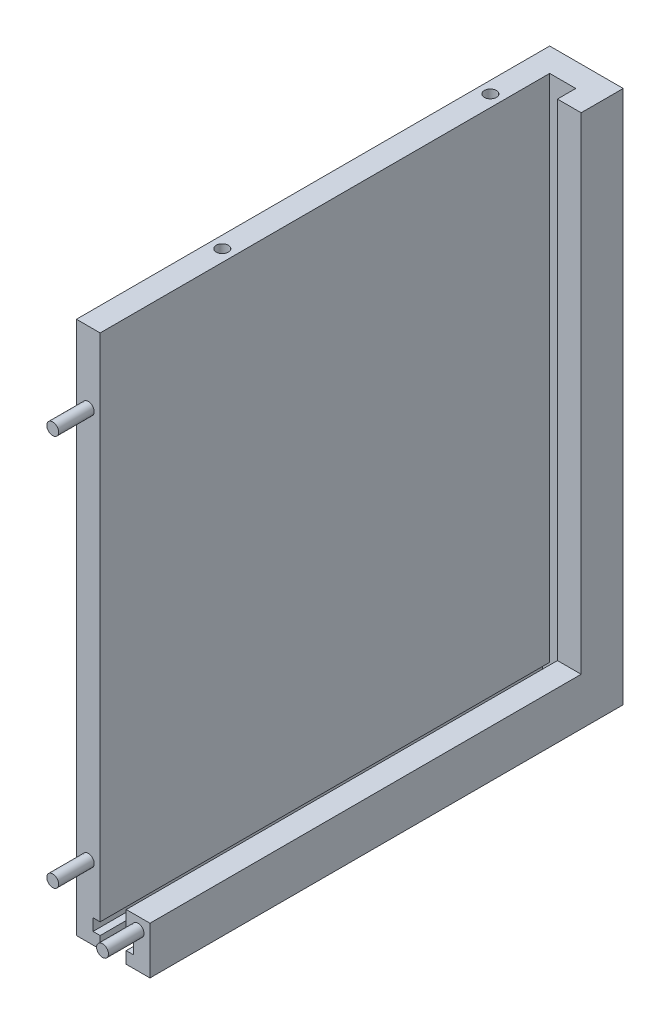
ISO-10303-21;
HEADER;
FILE_DESCRIPTION(('STEP AP214'),'2;1');
FILE_NAME('part.step','',(''),(''),'','','');
FILE_SCHEMA(('AUTOMOTIVE_DESIGN { 1 0 10303 214 1 1 1 1 }'));
ENDSEC;
DATA;
#1=APPLICATION_CONTEXT('core data for automotive mechanical design processes');
#2=APPLICATION_PROTOCOL_DEFINITION('international standard','automotive_design',2000,#1);
#3=PRODUCT_CONTEXT('',#1,'mechanical');
#4=PRODUCT('Part','Part','',(#3));
#5=PRODUCT_RELATED_PRODUCT_CATEGORY('part','',(#4));
#6=PRODUCT_DEFINITION_FORMATION('','',#4);
#7=PRODUCT_DEFINITION_CONTEXT('part definition',#1,'design');
#8=PRODUCT_DEFINITION('design','',#6,#7);
#9=PRODUCT_DEFINITION_SHAPE('','',#8);
#10=(LENGTH_UNIT() NAMED_UNIT(*) SI_UNIT(.MILLI.,.METRE.));
#11=(NAMED_UNIT(*) PLANE_ANGLE_UNIT() SI_UNIT($,.RADIAN.));
#12=(NAMED_UNIT(*) SI_UNIT($,.STERADIAN.) SOLID_ANGLE_UNIT());
#13=UNCERTAINTY_MEASURE_WITH_UNIT(LENGTH_MEASURE(1.E-05),#10,'distance_accuracy_value','');
#14=(GEOMETRIC_REPRESENTATION_CONTEXT(3) GLOBAL_UNCERTAINTY_ASSIGNED_CONTEXT((#13)) GLOBAL_UNIT_ASSIGNED_CONTEXT((#10,
#11,#12)) REPRESENTATION_CONTEXT('',''));
#15=CARTESIAN_POINT('',(0.,0.,0.));
#16=DIRECTION('',(0.,0.,1.));
#17=DIRECTION('',(1.,0.,0.));
#18=AXIS2_PLACEMENT_3D('',#15,#16,#17);
#19=CARTESIAN_POINT('',(0.,0.,-199.51));
#20=DIRECTION('',(0.,-1.,0.));
#21=DIRECTION('',(0.,0.,-1.));
#22=AXIS2_PLACEMENT_3D('',#19,#20,#21);
#23=PLANE('',#22);
#24=CARTESIAN_POINT('',(4.99999999999995,0.,-169.5));
#25=DIRECTION('',(0.,1.,0.));
#26=DIRECTION('',(0.,0.,1.));
#27=AXIS2_PLACEMENT_3D('',#24,#25,#26);
#28=CIRCLE('',#27,2.55);
#29=CARTESIAN_POINT('',(4.99999999999995,0.,-166.95));
#30=VERTEX_POINT('',#29);
#31=EDGE_CURVE('E292',#30,#30,#28,.T.);
#32=ORIENTED_EDGE('',*,*,#31,.F.);
#33=EDGE_LOOP('',(#32));
#34=FACE_BOUND('',#33,.T.);
#35=CARTESIAN_POINT('',(4.99999999999997,0.,-56.5));
#36=DIRECTION('',(0.,1.,0.));
#37=DIRECTION('',(0.,0.,1.));
#38=AXIS2_PLACEMENT_3D('',#35,#36,#37);
#39=CIRCLE('',#38,2.55);
#40=CARTESIAN_POINT('',(4.99999999999997,0.,-53.95));
#41=VERTEX_POINT('',#40);
#42=EDGE_CURVE('E299',#41,#41,#39,.T.);
#43=ORIENTED_EDGE('',*,*,#42,.F.);
#44=EDGE_LOOP('',(#43));
#45=FACE_BOUND('',#44,.T.);
#46=DIRECTION('',(-1.,0.,0.));
#47=VECTOR('',#46,1.);
#48=CARTESIAN_POINT('',(0.,0.,0.));
#49=LINE('',#48,#47);
#50=CARTESIAN_POINT('',(10.,0.,0.));
#51=VERTEX_POINT('',#50);
#52=CARTESIAN_POINT('',(0.,0.,0.));
#53=VERTEX_POINT('',#52);
#54=EDGE_CURVE('E180',#51,#53,#49,.T.);
#55=ORIENTED_EDGE('',*,*,#54,.F.);
#56=DIRECTION('',(0.,0.,1.));
#57=VECTOR('',#56,1.);
#58=CARTESIAN_POINT('',(10.,0.,0.));
#59=LINE('',#58,#57);
#60=CARTESIAN_POINT('',(10.,0.,-189.5));
#61=VERTEX_POINT('',#60);
#62=EDGE_CURVE('E212',#61,#51,#59,.T.);
#63=ORIENTED_EDGE('',*,*,#62,.F.);
#64=DIRECTION('',(1.,0.,0.));
#65=VECTOR('',#64,1.);
#66=CARTESIAN_POINT('',(21.,0.,-189.5));
#67=LINE('',#66,#65);
#68=CARTESIAN_POINT('',(21.,0.,-189.5));
#69=VERTEX_POINT('',#68);
#70=EDGE_CURVE('E46',#61,#69,#67,.T.);
#71=ORIENTED_EDGE('',*,*,#70,.T.);
#72=DIRECTION('',(0.,0.,1.));
#73=VECTOR('',#72,1.);
#74=CARTESIAN_POINT('',(21.,0.,0.));
#75=LINE('',#74,#73);
#76=CARTESIAN_POINT('',(21.,0.,-181.766666666667));
#77=VERTEX_POINT('',#76);
#78=EDGE_CURVE('E222',#69,#77,#75,.T.);
#79=ORIENTED_EDGE('',*,*,#78,.T.);
#80=DIRECTION('',(1.,0.,0.));
#81=VECTOR('',#80,1.);
#82=CARTESIAN_POINT('',(31.,0.,-181.766666666667));
#83=LINE('',#82,#81);
#84=CARTESIAN_POINT('',(31.,0.,-181.766666666667));
#85=VERTEX_POINT('',#84);
#86=EDGE_CURVE('E215',#77,#85,#83,.T.);
#87=ORIENTED_EDGE('',*,*,#86,.T.);
#88=DIRECTION('',(0.,0.,1.));
#89=VECTOR('',#88,1.);
#90=CARTESIAN_POINT('',(31.,0.,0.));
#91=LINE('',#90,#89);
#92=CARTESIAN_POINT('',(31.,0.,-199.5));
#93=VERTEX_POINT('',#92);
#94=EDGE_CURVE('E216',#93,#85,#91,.T.);
#95=ORIENTED_EDGE('',*,*,#94,.F.);
#96=DIRECTION('',(1.,0.,0.));
#97=VECTOR('',#96,1.);
#98=CARTESIAN_POINT('',(10.,0.,-199.5));
#99=LINE('',#98,#97);
#100=CARTESIAN_POINT('',(0.,0.,-199.5));
#101=VERTEX_POINT('',#100);
#102=EDGE_CURVE('E218',#101,#93,#99,.T.);
#103=ORIENTED_EDGE('',*,*,#102,.F.);
#104=DIRECTION('',(0.,0.,1.));
#105=VECTOR('',#104,1.);
#106=CARTESIAN_POINT('',(0.,0.,0.));
#107=LINE('',#106,#105);
#108=EDGE_CURVE('E219',#101,#53,#107,.T.);
#109=ORIENTED_EDGE('',*,*,#108,.T.);
#110=EDGE_LOOP('',(#55,#63,#71,#79,#87,#95,#103,#109));
#111=FACE_BOUND('',#110,.T.);
#112=ADVANCED_FACE('F39',(#34,#45,#111),#23,.F.);
#113=CARTESIAN_POINT('',(10.,-225.,-199.5));
#114=DIRECTION('',(0.,1.,0.));
#115=DIRECTION('',(0.,0.,1.));
#116=AXIS2_PLACEMENT_3D('',#113,#114,#115);
#117=PLANE('',#116);
#118=DIRECTION('',(1.,0.,0.));
#119=VECTOR('',#118,1.);
#120=CARTESIAN_POINT('',(0.,-225.,0.));
#121=LINE('',#120,#119);
#122=CARTESIAN_POINT('',(0.,-225.,0.));
#123=VERTEX_POINT('',#122);
#124=CARTESIAN_POINT('',(10.,-225.,0.));
#125=VERTEX_POINT('',#124);
#126=EDGE_CURVE('E169',#123,#125,#121,.T.);
#127=ORIENTED_EDGE('',*,*,#126,.F.);
#128=DIRECTION('',(0.,0.,-1.));
#129=VECTOR('',#128,1.);
#130=CARTESIAN_POINT('',(0.,-225.,-199.5));
#131=LINE('',#130,#129);
#132=CARTESIAN_POINT('',(0.,-225.,-199.5));
#133=VERTEX_POINT('',#132);
#134=EDGE_CURVE('E203',#123,#133,#131,.T.);
#135=ORIENTED_EDGE('',*,*,#134,.T.);
#136=DIRECTION('',(-1.,0.,0.));
#137=VECTOR('',#136,1.);
#138=CARTESIAN_POINT('',(10.,-225.,-199.5));
#139=LINE('',#138,#137);
#140=CARTESIAN_POINT('',(31.,-225.,-199.5));
#141=VERTEX_POINT('',#140);
#142=EDGE_CURVE('E185',#141,#133,#139,.T.);
#143=ORIENTED_EDGE('',*,*,#142,.F.);
#144=DIRECTION('',(0.,0.,-1.));
#145=VECTOR('',#144,1.);
#146=CARTESIAN_POINT('',(31.,-225.,-199.5));
#147=LINE('',#146,#145);
#148=CARTESIAN_POINT('',(31.,-225.,0.));
#149=VERTEX_POINT('',#148);
#150=EDGE_CURVE('E176',#149,#141,#147,.T.);
#151=ORIENTED_EDGE('',*,*,#150,.F.);
#152=CARTESIAN_POINT('',(21.,-225.,0.));
#153=VERTEX_POINT('',#152);
#154=EDGE_CURVE('E160',#153,#149,#121,.T.);
#155=ORIENTED_EDGE('',*,*,#154,.F.);
#156=DIRECTION('',(0.,0.,1.));
#157=VECTOR('',#156,1.);
#158=CARTESIAN_POINT('',(21.,-225.,-189.5));
#159=LINE('',#158,#157);
#160=CARTESIAN_POINT('',(21.,-225.,-189.5));
#161=VERTEX_POINT('',#160);
#162=EDGE_CURVE('E321',#161,#153,#159,.T.);
#163=ORIENTED_EDGE('',*,*,#162,.F.);
#164=DIRECTION('',(1.,0.,0.));
#165=VECTOR('',#164,1.);
#166=CARTESIAN_POINT('',(0.,-225.,-189.5));
#167=LINE('',#166,#165);
#168=CARTESIAN_POINT('',(10.,-225.,-189.5));
#169=VERTEX_POINT('',#168);
#170=EDGE_CURVE('E295',#169,#161,#167,.T.);
#171=ORIENTED_EDGE('',*,*,#170,.F.);
#172=DIRECTION('',(0.,0.,1.));
#173=VECTOR('',#172,1.);
#174=CARTESIAN_POINT('',(10.,-225.,-189.5));
#175=LINE('',#174,#173);
#176=EDGE_CURVE('E244',#169,#125,#175,.T.);
#177=ORIENTED_EDGE('',*,*,#176,.T.);
#178=EDGE_LOOP('',(#127,#135,#143,#151,#155,#163,#171,#177));
#179=FACE_BOUND('',#178,.T.);
#180=ADVANCED_FACE('F183',(#179),#117,.F.);
#181=CARTESIAN_POINT('',(0.,0.,0.));
#182=DIRECTION('',(-1.,0.,0.));
#183=DIRECTION('',(0.,0.,1.));
#184=AXIS2_PLACEMENT_3D('',#181,#182,#183);
#185=PLANE('',#184);
#186=ORIENTED_EDGE('',*,*,#134,.F.);
#187=DIRECTION('',(0.,-1.,0.));
#188=VECTOR('',#187,1.);
#189=CARTESIAN_POINT('',(0.,-225.,0.));
#190=LINE('',#189,#188);
#191=EDGE_CURVE('E438',#53,#123,#190,.T.);
#192=ORIENTED_EDGE('',*,*,#191,.F.);
#193=ORIENTED_EDGE('',*,*,#108,.F.);
#194=DIRECTION('',(0.,1.,0.));
#195=VECTOR('',#194,1.);
#196=CARTESIAN_POINT('',(0.,-225.,-199.5));
#197=LINE('',#196,#195);
#198=EDGE_CURVE('E208',#133,#101,#197,.T.);
#199=ORIENTED_EDGE('',*,*,#198,.F.);
#200=EDGE_LOOP('',(#186,#192,#193,#199));
#201=FACE_BOUND('',#200,.T.);
#202=ADVANCED_FACE('F366',(#201),#185,.T.);
#203=CARTESIAN_POINT('',(21.,0.,0.));
#204=DIRECTION('',(-1.,0.,0.));
#205=DIRECTION('',(0.,0.,1.));
#206=AXIS2_PLACEMENT_3D('',#203,#204,#205);
#207=PLANE('',#206);
#208=DIRECTION('',(0.,0.,-1.));
#209=VECTOR('',#208,1.);
#210=CARTESIAN_POINT('',(21.,-215.,-189.5));
#211=LINE('',#210,#209);
#212=CARTESIAN_POINT('',(21.,-215.,0.));
#213=VERTEX_POINT('',#212);
#214=CARTESIAN_POINT('',(21.,-215.,-189.5));
#215=VERTEX_POINT('',#214);
#216=EDGE_CURVE('E197',#213,#215,#211,.T.);
#217=ORIENTED_EDGE('',*,*,#216,.F.);
#218=DIRECTION('',(0.,1.,0.));
#219=VECTOR('',#218,1.);
#220=CARTESIAN_POINT('',(21.,0.,0.));
#221=LINE('',#220,#219);
#222=CARTESIAN_POINT('',(21.,-205.,0.));
#223=VERTEX_POINT('',#222);
#224=EDGE_CURVE('E262',#213,#223,#221,.T.);
#225=ORIENTED_EDGE('',*,*,#224,.T.);
#226=DIRECTION('',(0.,0.,-1.));
#227=VECTOR('',#226,1.);
#228=CARTESIAN_POINT('',(21.,-205.,-181.766666666667));
#229=LINE('',#228,#227);
#230=CARTESIAN_POINT('',(21.,-205.,-181.766666666667));
#231=VERTEX_POINT('',#230);
#232=EDGE_CURVE('E243',#223,#231,#229,.T.);
#233=ORIENTED_EDGE('',*,*,#232,.T.);
#234=DIRECTION('',(0.,1.,0.));
#235=VECTOR('',#234,1.);
#236=CARTESIAN_POINT('',(21.,-205.,-181.766666666667));
#237=LINE('',#236,#235);
#238=EDGE_CURVE('E239',#231,#77,#237,.T.);
#239=ORIENTED_EDGE('',*,*,#238,.T.);
#240=ORIENTED_EDGE('',*,*,#78,.F.);
#241=DIRECTION('',(0.,1.,0.));
#242=VECTOR('',#241,1.);
#243=CARTESIAN_POINT('',(21.,-215.,-189.5));
#244=LINE('',#243,#242);
#245=EDGE_CURVE('E199',#215,#69,#244,.T.);
#246=ORIENTED_EDGE('',*,*,#245,.F.);
#247=EDGE_LOOP('',(#217,#225,#233,#239,#240,#246));
#248=FACE_BOUND('',#247,.T.);
#249=ADVANCED_FACE('F249',(#248),#207,.T.);
#250=CARTESIAN_POINT('',(31.,0.,0.));
#251=DIRECTION('',(-1.,0.,0.));
#252=DIRECTION('',(0.,0.,1.));
#253=AXIS2_PLACEMENT_3D('',#250,#251,#252);
#254=PLANE('',#253);
#255=DIRECTION('',(0.,1.,0.));
#256=VECTOR('',#255,1.);
#257=CARTESIAN_POINT('',(31.,-225.,0.));
#258=LINE('',#257,#256);
#259=CARTESIAN_POINT('',(31.,-205.,0.));
#260=VERTEX_POINT('',#259);
#261=EDGE_CURVE('E163',#149,#260,#258,.T.);
#262=ORIENTED_EDGE('',*,*,#261,.F.);
#263=ORIENTED_EDGE('',*,*,#150,.T.);
#264=DIRECTION('',(0.,1.,0.));
#265=VECTOR('',#264,1.);
#266=CARTESIAN_POINT('',(31.,-225.,-199.5));
#267=LINE('',#266,#265);
#268=EDGE_CURVE('E187',#141,#93,#267,.T.);
#269=ORIENTED_EDGE('',*,*,#268,.T.);
#270=ORIENTED_EDGE('',*,*,#94,.T.);
#271=DIRECTION('',(0.,1.,0.));
#272=VECTOR('',#271,1.);
#273=CARTESIAN_POINT('',(31.,-205.,-181.766666666667));
#274=LINE('',#273,#272);
#275=CARTESIAN_POINT('',(31.,-205.,-181.766666666667));
#276=VERTEX_POINT('',#275);
#277=EDGE_CURVE('E193',#276,#85,#274,.T.);
#278=ORIENTED_EDGE('',*,*,#277,.F.);
#279=DIRECTION('',(0.,0.,-1.));
#280=VECTOR('',#279,1.);
#281=CARTESIAN_POINT('',(31.,-205.,-181.766666666667));
#282=LINE('',#281,#280);
#283=EDGE_CURVE('E179',#260,#276,#282,.T.);
#284=ORIENTED_EDGE('',*,*,#283,.F.);
#285=EDGE_LOOP('',(#262,#263,#269,#270,#278,#284));
#286=FACE_BOUND('',#285,.T.);
#287=ADVANCED_FACE('F174',(#286),#254,.F.);
#288=CARTESIAN_POINT('',(31.,-205.,-181.766666666667));
#289=DIRECTION('',(0.,1.,0.));
#290=DIRECTION('',(0.,0.,1.));
#291=AXIS2_PLACEMENT_3D('',#288,#289,#290);
#292=PLANE('',#291);
#293=ORIENTED_EDGE('',*,*,#232,.F.);
#294=DIRECTION('',(1.,0.,0.));
#295=VECTOR('',#294,1.);
#296=CARTESIAN_POINT('',(31.,-205.,0.));
#297=LINE('',#296,#295);
#298=EDGE_CURVE('E273',#223,#260,#297,.T.);
#299=ORIENTED_EDGE('',*,*,#298,.T.);
#300=ORIENTED_EDGE('',*,*,#283,.T.);
#301=DIRECTION('',(-1.,0.,0.));
#302=VECTOR('',#301,1.);
#303=CARTESIAN_POINT('',(31.,-205.,-181.766666666667));
#304=LINE('',#303,#302);
#305=EDGE_CURVE('E188',#276,#231,#304,.T.);
#306=ORIENTED_EDGE('',*,*,#305,.T.);
#307=EDGE_LOOP('',(#293,#299,#300,#306));
#308=FACE_BOUND('',#307,.T.);
#309=ADVANCED_FACE('F457',(#308),#292,.T.);
#310=CARTESIAN_POINT('',(10.,0.,0.));
#311=DIRECTION('',(-1.,0.,0.));
#312=DIRECTION('',(0.,0.,1.));
#313=AXIS2_PLACEMENT_3D('',#310,#311,#312);
#314=PLANE('',#313);
#315=DIRECTION('',(0.,1.,0.));
#316=VECTOR('',#315,1.);
#317=CARTESIAN_POINT('',(10.,0.,0.));
#318=LINE('',#317,#316);
#319=CARTESIAN_POINT('',(10.,-215.,0.));
#320=VERTEX_POINT('',#319);
#321=EDGE_CURVE('E276',#320,#51,#318,.T.);
#322=ORIENTED_EDGE('',*,*,#321,.F.);
#323=DIRECTION('',(0.,0.,-1.));
#324=VECTOR('',#323,1.);
#325=CARTESIAN_POINT('',(10.,-215.,-189.5));
#326=LINE('',#325,#324);
#327=CARTESIAN_POINT('',(10.,-215.,-189.5));
#328=VERTEX_POINT('',#327);
#329=EDGE_CURVE('E190',#320,#328,#326,.T.);
#330=ORIENTED_EDGE('',*,*,#329,.T.);
#331=DIRECTION('',(0.,1.,0.));
#332=VECTOR('',#331,1.);
#333=CARTESIAN_POINT('',(10.,-215.,-189.5));
#334=LINE('',#333,#332);
#335=EDGE_CURVE('E200',#328,#61,#334,.T.);
#336=ORIENTED_EDGE('',*,*,#335,.T.);
#337=ORIENTED_EDGE('',*,*,#62,.T.);
#338=EDGE_LOOP('',(#322,#330,#336,#337));
#339=FACE_BOUND('',#338,.T.);
#340=ADVANCED_FACE('F460',(#339),#314,.F.);
#341=CARTESIAN_POINT('',(0.,-215.,-189.5));
#342=DIRECTION('',(0.,1.,0.));
#343=DIRECTION('',(0.,0.,1.));
#344=AXIS2_PLACEMENT_3D('',#341,#342,#343);
#345=PLANE('',#344);
#346=DIRECTION('',(1.,0.,0.));
#347=VECTOR('',#346,1.);
#348=CARTESIAN_POINT('',(0.,-215.,0.));
#349=LINE('',#348,#347);
#350=CARTESIAN_POINT('',(7.,-215.,0.));
#351=VERTEX_POINT('',#350);
#352=EDGE_CURVE('E272',#351,#320,#349,.T.);
#353=ORIENTED_EDGE('',*,*,#352,.F.);
#354=DIRECTION('',(0.,0.,1.));
#355=VECTOR('',#354,1.);
#356=CARTESIAN_POINT('',(7.,-215.,-189.5));
#357=LINE('',#356,#355);
#358=CARTESIAN_POINT('',(7.,-215.,-189.5));
#359=VERTEX_POINT('',#358);
#360=EDGE_CURVE('E328',#359,#351,#357,.T.);
#361=ORIENTED_EDGE('',*,*,#360,.F.);
#362=DIRECTION('',(-1.,0.,0.));
#363=VECTOR('',#362,1.);
#364=CARTESIAN_POINT('',(0.,-215.,-189.5));
#365=LINE('',#364,#363);
#366=EDGE_CURVE('E314',#328,#359,#365,.T.);
#367=ORIENTED_EDGE('',*,*,#366,.F.);
#368=ORIENTED_EDGE('',*,*,#329,.F.);
#369=EDGE_LOOP('',(#353,#361,#367,#368));
#370=FACE_BOUND('',#369,.T.);
#371=ADVANCED_FACE('F357',(#370),#345,.F.);
#372=CARTESIAN_POINT('',(24.,-215.,0.));
#373=VERTEX_POINT('',#372);
#374=EDGE_CURVE('E267',#213,#373,#349,.T.);
#375=ORIENTED_EDGE('',*,*,#374,.F.);
#376=ORIENTED_EDGE('',*,*,#216,.T.);
#377=CARTESIAN_POINT('',(24.,-215.,-189.5));
#378=VERTEX_POINT('',#377);
#379=EDGE_CURVE('E261',#378,#215,#365,.T.);
#380=ORIENTED_EDGE('',*,*,#379,.F.);
#381=DIRECTION('',(0.,0.,1.));
#382=VECTOR('',#381,1.);
#383=CARTESIAN_POINT('',(24.,-215.,-189.5));
#384=LINE('',#383,#382);
#385=EDGE_CURVE('E268',#378,#373,#384,.T.);
#386=ORIENTED_EDGE('',*,*,#385,.T.);
#387=EDGE_LOOP('',(#375,#376,#380,#386));
#388=FACE_BOUND('',#387,.T.);
#389=ADVANCED_FACE('F265',(#388),#345,.F.);
#390=CARTESIAN_POINT('',(9.99999999999992,0.,-189.5));
#391=DIRECTION('',(1.,0.,0.));
#392=DIRECTION('',(0.,1.,0.));
#393=AXIS2_PLACEMENT_3D('',#390,#391,#392);
#394=PLANE('',#393);
#395=DIRECTION('',(0.,0.,1.));
#396=VECTOR('',#395,1.);
#397=CARTESIAN_POINT('',(10.,-220.,-189.5));
#398=LINE('',#397,#396);
#399=CARTESIAN_POINT('',(10.,-220.,-189.5));
#400=VERTEX_POINT('',#399);
#401=CARTESIAN_POINT('',(10.,-220.,0.));
#402=VERTEX_POINT('',#401);
#403=EDGE_CURVE('E323',#400,#402,#398,.T.);
#404=ORIENTED_EDGE('',*,*,#403,.T.);
#405=DIRECTION('',(0.,-1.,0.));
#406=VECTOR('',#405,1.);
#407=CARTESIAN_POINT('',(9.99999999999992,0.,0.));
#408=LINE('',#407,#406);
#409=EDGE_CURVE('E277',#402,#125,#408,.T.);
#410=ORIENTED_EDGE('',*,*,#409,.T.);
#411=ORIENTED_EDGE('',*,*,#176,.F.);
#412=DIRECTION('',(0.,1.,0.));
#413=VECTOR('',#412,1.);
#414=CARTESIAN_POINT('',(9.99999999999992,0.,-189.5));
#415=LINE('',#414,#413);
#416=EDGE_CURVE('E319',#169,#400,#415,.T.);
#417=ORIENTED_EDGE('',*,*,#416,.T.);
#418=EDGE_LOOP('',(#404,#410,#411,#417));
#419=FACE_BOUND('',#418,.T.);
#420=ADVANCED_FACE('F345',(#419),#394,.T.);
#421=CARTESIAN_POINT('',(0.,-220.,-189.5));
#422=DIRECTION('',(0.,1.,0.));
#423=DIRECTION('',(0.,0.,1.));
#424=AXIS2_PLACEMENT_3D('',#421,#422,#423);
#425=PLANE('',#424);
#426=DIRECTION('',(0.,0.,1.));
#427=VECTOR('',#426,1.);
#428=CARTESIAN_POINT('',(7.,-220.,-189.5));
#429=LINE('',#428,#427);
#430=CARTESIAN_POINT('',(7.,-220.,-189.5));
#431=VERTEX_POINT('',#430);
#432=CARTESIAN_POINT('',(7.,-220.,0.));
#433=VERTEX_POINT('',#432);
#434=EDGE_CURVE('E325',#431,#433,#429,.T.);
#435=ORIENTED_EDGE('',*,*,#434,.T.);
#436=DIRECTION('',(1.,0.,0.));
#437=VECTOR('',#436,1.);
#438=CARTESIAN_POINT('',(0.,-220.,0.));
#439=LINE('',#438,#437);
#440=EDGE_CURVE('E53',#433,#402,#439,.T.);
#441=ORIENTED_EDGE('',*,*,#440,.T.);
#442=ORIENTED_EDGE('',*,*,#403,.F.);
#443=DIRECTION('',(-1.,0.,0.));
#444=VECTOR('',#443,1.);
#445=CARTESIAN_POINT('',(0.,-220.,-189.5));
#446=LINE('',#445,#444);
#447=EDGE_CURVE('E312',#400,#431,#446,.T.);
#448=ORIENTED_EDGE('',*,*,#447,.T.);
#449=EDGE_LOOP('',(#435,#441,#442,#448));
#450=FACE_BOUND('',#449,.T.);
#451=ADVANCED_FACE('F347',(#450),#425,.T.);
#452=CARTESIAN_POINT('',(6.99999999999996,0.,-189.5));
#453=DIRECTION('',(1.,0.,0.));
#454=DIRECTION('',(0.,1.,0.));
#455=AXIS2_PLACEMENT_3D('',#452,#453,#454);
#456=PLANE('',#455);
#457=ORIENTED_EDGE('',*,*,#360,.T.);
#458=DIRECTION('',(0.,-1.,0.));
#459=VECTOR('',#458,1.);
#460=CARTESIAN_POINT('',(6.99999999999996,0.,0.));
#461=LINE('',#460,#459);
#462=EDGE_CURVE('E288',#351,#433,#461,.T.);
#463=ORIENTED_EDGE('',*,*,#462,.T.);
#464=ORIENTED_EDGE('',*,*,#434,.F.);
#465=DIRECTION('',(0.,1.,0.));
#466=VECTOR('',#465,1.);
#467=CARTESIAN_POINT('',(6.99999999999996,0.,-189.5));
#468=LINE('',#467,#466);
#469=EDGE_CURVE('E316',#431,#359,#468,.T.);
#470=ORIENTED_EDGE('',*,*,#469,.T.);
#471=EDGE_LOOP('',(#457,#463,#464,#470));
#472=FACE_BOUND('',#471,.T.);
#473=ADVANCED_FACE('F353',(#472),#456,.T.);
#474=CARTESIAN_POINT('',(24.,0.,-189.5));
#475=DIRECTION('',(1.,0.,0.));
#476=DIRECTION('',(0.,0.,-1.));
#477=AXIS2_PLACEMENT_3D('',#474,#475,#476);
#478=PLANE('',#477);
#479=DIRECTION('',(0.,-1.,0.));
#480=VECTOR('',#479,1.);
#481=CARTESIAN_POINT('',(24.,0.,0.));
#482=LINE('',#481,#480);
#483=CARTESIAN_POINT('',(24.,-220.,0.));
#484=VERTEX_POINT('',#483);
#485=EDGE_CURVE('E270',#373,#484,#482,.T.);
#486=ORIENTED_EDGE('',*,*,#485,.F.);
#487=ORIENTED_EDGE('',*,*,#385,.F.);
#488=DIRECTION('',(0.,1.,0.));
#489=VECTOR('',#488,1.);
#490=CARTESIAN_POINT('',(24.,0.,-189.5));
#491=LINE('',#490,#489);
#492=CARTESIAN_POINT('',(24.,-220.,-189.5));
#493=VERTEX_POINT('',#492);
#494=EDGE_CURVE('E311',#493,#378,#491,.T.);
#495=ORIENTED_EDGE('',*,*,#494,.F.);
#496=DIRECTION('',(0.,0.,1.));
#497=VECTOR('',#496,1.);
#498=CARTESIAN_POINT('',(24.,-220.,-189.5));
#499=LINE('',#498,#497);
#500=EDGE_CURVE('E332',#493,#484,#499,.T.);
#501=ORIENTED_EDGE('',*,*,#500,.T.);
#502=EDGE_LOOP('',(#486,#487,#495,#501));
#503=FACE_BOUND('',#502,.T.);
#504=ADVANCED_FACE('F443',(#503),#478,.F.);
#505=DIRECTION('',(0.,0.,1.));
#506=VECTOR('',#505,1.);
#507=CARTESIAN_POINT('',(21.,-220.,-189.5));
#508=LINE('',#507,#506);
#509=CARTESIAN_POINT('',(21.,-220.,-189.5));
#510=VERTEX_POINT('',#509);
#511=CARTESIAN_POINT('',(21.,-220.,0.));
#512=VERTEX_POINT('',#511);
#513=EDGE_CURVE('E335',#510,#512,#508,.T.);
#514=ORIENTED_EDGE('',*,*,#513,.T.);
#515=DIRECTION('',(1.,0.,0.));
#516=VECTOR('',#515,1.);
#517=CARTESIAN_POINT('',(0.,-220.,0.));
#518=LINE('',#517,#516);
#519=EDGE_CURVE('E60',#512,#484,#518,.T.);
#520=ORIENTED_EDGE('',*,*,#519,.T.);
#521=ORIENTED_EDGE('',*,*,#500,.F.);
#522=EDGE_CURVE('E309',#493,#510,#446,.T.);
#523=ORIENTED_EDGE('',*,*,#522,.T.);
#524=EDGE_LOOP('',(#514,#520,#521,#523));
#525=FACE_BOUND('',#524,.T.);
#526=ADVANCED_FACE('F356',(#525),#425,.T.);
#527=CARTESIAN_POINT('',(21.,0.,-189.5));
#528=DIRECTION('',(1.,0.,0.));
#529=DIRECTION('',(0.,0.,-1.));
#530=AXIS2_PLACEMENT_3D('',#527,#528,#529);
#531=PLANE('',#530);
#532=DIRECTION('',(0.,-1.,0.));
#533=VECTOR('',#532,1.);
#534=CARTESIAN_POINT('',(21.,0.,0.));
#535=LINE('',#534,#533);
#536=EDGE_CURVE('E11',#512,#153,#535,.T.);
#537=ORIENTED_EDGE('',*,*,#536,.F.);
#538=ORIENTED_EDGE('',*,*,#513,.F.);
#539=DIRECTION('',(0.,1.,0.));
#540=VECTOR('',#539,1.);
#541=CARTESIAN_POINT('',(21.,0.,-189.5));
#542=LINE('',#541,#540);
#543=EDGE_CURVE('E306',#161,#510,#542,.T.);
#544=ORIENTED_EDGE('',*,*,#543,.F.);
#545=ORIENTED_EDGE('',*,*,#162,.T.);
#546=EDGE_LOOP('',(#537,#538,#544,#545));
#547=FACE_BOUND('',#546,.T.);
#548=ADVANCED_FACE('F338',(#547),#531,.F.);
#549=CARTESIAN_POINT('',(10.,-225.,-199.5));
#550=DIRECTION('',(0.,0.,1.));
#551=DIRECTION('',(1.,0.,0.));
#552=AXIS2_PLACEMENT_3D('',#549,#550,#551);
#553=PLANE('',#552);
#554=ORIENTED_EDGE('',*,*,#198,.T.);
#555=ORIENTED_EDGE('',*,*,#102,.T.);
#556=ORIENTED_EDGE('',*,*,#268,.F.);
#557=ORIENTED_EDGE('',*,*,#142,.T.);
#558=EDGE_LOOP('',(#554,#555,#556,#557));
#559=FACE_BOUND('',#558,.T.);
#560=ADVANCED_FACE('F230',(#559),#553,.F.);
#561=CARTESIAN_POINT('',(31.,-205.,-181.766666666667));
#562=DIRECTION('',(0.,0.,1.));
#563=DIRECTION('',(1.,0.,0.));
#564=AXIS2_PLACEMENT_3D('',#561,#562,#563);
#565=PLANE('',#564);
#566=ORIENTED_EDGE('',*,*,#86,.F.);
#567=ORIENTED_EDGE('',*,*,#238,.F.);
#568=ORIENTED_EDGE('',*,*,#305,.F.);
#569=ORIENTED_EDGE('',*,*,#277,.T.);
#570=EDGE_LOOP('',(#566,#567,#568,#569));
#571=FACE_BOUND('',#570,.T.);
#572=ADVANCED_FACE('F253',(#571),#565,.T.);
#573=CARTESIAN_POINT('',(21.,-215.,-189.5));
#574=DIRECTION('',(0.,0.,1.));
#575=DIRECTION('',(1.,0.,0.));
#576=AXIS2_PLACEMENT_3D('',#573,#574,#575);
#577=PLANE('',#576);
#578=ORIENTED_EDGE('',*,*,#70,.F.);
#579=ORIENTED_EDGE('',*,*,#335,.F.);
#580=ORIENTED_EDGE('',*,*,#366,.T.);
#581=ORIENTED_EDGE('',*,*,#469,.F.);
#582=ORIENTED_EDGE('',*,*,#447,.F.);
#583=ORIENTED_EDGE('',*,*,#416,.F.);
#584=ORIENTED_EDGE('',*,*,#170,.T.);
#585=ORIENTED_EDGE('',*,*,#543,.T.);
#586=ORIENTED_EDGE('',*,*,#522,.F.);
#587=ORIENTED_EDGE('',*,*,#494,.T.);
#588=ORIENTED_EDGE('',*,*,#379,.T.);
#589=ORIENTED_EDGE('',*,*,#245,.T.);
#590=EDGE_LOOP('',(#578,#579,#580,#581,#582,#583,#584,#585,#586,#587,#588,#589));
#591=FACE_BOUND('',#590,.T.);
#592=ADVANCED_FACE('F258',(#591),#577,.T.);
#593=CARTESIAN_POINT('',(4.99999999999995,-15.,-169.5));
#594=DIRECTION('',(0.,1.,0.));
#595=DIRECTION('',(0.,0.,1.));
#596=AXIS2_PLACEMENT_3D('',#593,#594,#595);
#597=CYLINDRICAL_SURFACE('',#596,2.55);
#598=CARTESIAN_POINT('',(4.99999999999995,-15.,-169.5));
#599=DIRECTION('',(0.,1.,0.));
#600=DIRECTION('',(0.,0.,1.));
#601=AXIS2_PLACEMENT_3D('',#598,#599,#600);
#602=CIRCLE('',#601,2.55);
#603=CARTESIAN_POINT('',(4.99999999999995,-15.,-166.95));
#604=VERTEX_POINT('',#603);
#605=EDGE_CURVE('E296',#604,#604,#602,.T.);
#606=ORIENTED_EDGE('',*,*,#605,.F.);
#607=EDGE_LOOP('',(#606));
#608=FACE_BOUND('',#607,.T.);
#609=ORIENTED_EDGE('',*,*,#31,.T.);
#610=EDGE_LOOP('',(#609));
#611=FACE_BOUND('',#610,.T.);
#612=ADVANCED_FACE('F381',(#608,#611),#597,.F.);
#613=CARTESIAN_POINT('',(4.99999999999995,-15.,-169.5));
#614=DIRECTION('',(0.,1.,0.));
#615=DIRECTION('',(0.,0.,1.));
#616=AXIS2_PLACEMENT_3D('',#613,#614,#615);
#617=PLANE('',#616);
#618=ORIENTED_EDGE('',*,*,#605,.T.);
#619=EDGE_LOOP('',(#618));
#620=FACE_BOUND('',#619,.T.);
#621=ADVANCED_FACE('F374',(#620),#617,.T.);
#622=CARTESIAN_POINT('',(4.99999999999997,-15.,-56.5));
#623=DIRECTION('',(0.,1.,0.));
#624=DIRECTION('',(0.,0.,1.));
#625=AXIS2_PLACEMENT_3D('',#622,#623,#624);
#626=CYLINDRICAL_SURFACE('',#625,2.55);
#627=CARTESIAN_POINT('',(4.99999999999997,-15.,-56.5));
#628=DIRECTION('',(0.,1.,0.));
#629=DIRECTION('',(0.,0.,1.));
#630=AXIS2_PLACEMENT_3D('',#627,#628,#629);
#631=CIRCLE('',#630,2.55);
#632=CARTESIAN_POINT('',(4.99999999999997,-15.,-53.95));
#633=VERTEX_POINT('',#632);
#634=EDGE_CURVE('E280',#633,#633,#631,.T.);
#635=ORIENTED_EDGE('',*,*,#634,.F.);
#636=EDGE_LOOP('',(#635));
#637=FACE_BOUND('',#636,.T.);
#638=ORIENTED_EDGE('',*,*,#42,.T.);
#639=EDGE_LOOP('',(#638));
#640=FACE_BOUND('',#639,.T.);
#641=ADVANCED_FACE('F371',(#637,#640),#626,.F.);
#642=CARTESIAN_POINT('',(4.99999999999997,-15.,-56.5));
#643=DIRECTION('',(0.,1.,0.));
#644=DIRECTION('',(0.,0.,1.));
#645=AXIS2_PLACEMENT_3D('',#642,#643,#644);
#646=PLANE('',#645);
#647=ORIENTED_EDGE('',*,*,#634,.T.);
#648=EDGE_LOOP('',(#647));
#649=FACE_BOUND('',#648,.T.);
#650=ADVANCED_FACE('F373',(#649),#646,.T.);
#651=CARTESIAN_POINT('',(0.,0.,0.));
#652=DIRECTION('',(0.,0.,1.));
#653=DIRECTION('',(1.,0.,0.));
#654=AXIS2_PLACEMENT_3D('',#651,#652,#653);
#655=PLANE('',#654);
#656=CARTESIAN_POINT('',(26.,-210.,0.));
#657=DIRECTION('',(0.,0.,1.));
#658=DIRECTION('',(1.,0.,0.));
#659=AXIS2_PLACEMENT_3D('',#656,#657,#658);
#660=CIRCLE('',#659,2.5);
#661=CARTESIAN_POINT('',(28.5,-210.,0.));
#662=VERTEX_POINT('',#661);
#663=EDGE_CURVE('E420',#662,#662,#660,.T.);
#664=ORIENTED_EDGE('',*,*,#663,.F.);
#665=EDGE_LOOP('',(#664));
#666=FACE_BOUND('',#665,.T.);
#667=ORIENTED_EDGE('',*,*,#224,.F.);
#668=ORIENTED_EDGE('',*,*,#374,.T.);
#669=ORIENTED_EDGE('',*,*,#485,.T.);
#670=ORIENTED_EDGE('',*,*,#519,.F.);
#671=ORIENTED_EDGE('',*,*,#536,.T.);
#672=ORIENTED_EDGE('',*,*,#154,.T.);
#673=ORIENTED_EDGE('',*,*,#261,.T.);
#674=ORIENTED_EDGE('',*,*,#298,.F.);
#675=EDGE_LOOP('',(#667,#668,#669,#670,#671,#672,#673,#674));
#676=FACE_BOUND('',#675,.T.);
#677=ADVANCED_FACE('F162',(#666,#676),#655,.T.);
#678=CARTESIAN_POINT('',(5.,-30.,0.));
#679=DIRECTION('',(0.,0.,1.));
#680=DIRECTION('',(1.,0.,0.));
#681=AXIS2_PLACEMENT_3D('',#678,#679,#680);
#682=CIRCLE('',#681,2.5);
#683=CARTESIAN_POINT('',(7.5,-30.,0.));
#684=VERTEX_POINT('',#683);
#685=EDGE_CURVE('E423',#684,#684,#682,.T.);
#686=ORIENTED_EDGE('',*,*,#685,.F.);
#687=EDGE_LOOP('',(#686));
#688=FACE_BOUND('',#687,.T.);
#689=CARTESIAN_POINT('',(5.00000000000002,-195.,0.));
#690=DIRECTION('',(0.,0.,1.));
#691=DIRECTION('',(1.,0.,0.));
#692=AXIS2_PLACEMENT_3D('',#689,#690,#691);
#693=CIRCLE('',#692,2.5);
#694=CARTESIAN_POINT('',(7.50000000000002,-195.,0.));
#695=VERTEX_POINT('',#694);
#696=EDGE_CURVE('E431',#695,#695,#693,.T.);
#697=ORIENTED_EDGE('',*,*,#696,.F.);
#698=EDGE_LOOP('',(#697));
#699=FACE_BOUND('',#698,.T.);
#700=ORIENTED_EDGE('',*,*,#321,.T.);
#701=ORIENTED_EDGE('',*,*,#54,.T.);
#702=ORIENTED_EDGE('',*,*,#191,.T.);
#703=ORIENTED_EDGE('',*,*,#126,.T.);
#704=ORIENTED_EDGE('',*,*,#409,.F.);
#705=ORIENTED_EDGE('',*,*,#440,.F.);
#706=ORIENTED_EDGE('',*,*,#462,.F.);
#707=ORIENTED_EDGE('',*,*,#352,.T.);
#708=EDGE_LOOP('',(#700,#701,#702,#703,#704,#705,#706,#707));
#709=FACE_BOUND('',#708,.T.);
#710=ADVANCED_FACE('F391',(#688,#699,#709),#655,.T.);
#711=CARTESIAN_POINT('',(5.00000000000002,-195.,15.));
#712=DIRECTION('',(0.,0.,-1.));
#713=DIRECTION('',(-1.,0.,0.));
#714=AXIS2_PLACEMENT_3D('',#711,#712,#713);
#715=CYLINDRICAL_SURFACE('',#714,2.5);
#716=CARTESIAN_POINT('',(5.00000000000002,-195.,15.));
#717=DIRECTION('',(0.,0.,1.));
#718=DIRECTION('',(1.,0.,0.));
#719=AXIS2_PLACEMENT_3D('',#716,#717,#718);
#720=CIRCLE('',#719,2.5);
#721=CARTESIAN_POINT('',(7.50000000000002,-195.,15.));
#722=VERTEX_POINT('',#721);
#723=EDGE_CURVE('E434',#722,#722,#720,.T.);
#724=ORIENTED_EDGE('',*,*,#723,.F.);
#725=EDGE_LOOP('',(#724));
#726=FACE_BOUND('',#725,.T.);
#727=ORIENTED_EDGE('',*,*,#696,.T.);
#728=EDGE_LOOP('',(#727));
#729=FACE_BOUND('',#728,.T.);
#730=ADVANCED_FACE('F397',(#726,#729),#715,.T.);
#731=CARTESIAN_POINT('',(5.00000000000002,-195.,15.));
#732=DIRECTION('',(0.,0.,1.));
#733=DIRECTION('',(1.,0.,0.));
#734=AXIS2_PLACEMENT_3D('',#731,#732,#733);
#735=PLANE('',#734);
#736=ORIENTED_EDGE('',*,*,#723,.T.);
#737=EDGE_LOOP('',(#736));
#738=FACE_BOUND('',#737,.T.);
#739=ADVANCED_FACE('F393',(#738),#735,.T.);
#740=CARTESIAN_POINT('',(5.,-30.,15.));
#741=DIRECTION('',(0.,0.,-1.));
#742=DIRECTION('',(-1.,0.,0.));
#743=AXIS2_PLACEMENT_3D('',#740,#741,#742);
#744=CYLINDRICAL_SURFACE('',#743,2.5);
#745=CARTESIAN_POINT('',(5.,-30.,15.));
#746=DIRECTION('',(0.,0.,1.));
#747=DIRECTION('',(1.,0.,0.));
#748=AXIS2_PLACEMENT_3D('',#745,#746,#747);
#749=CIRCLE('',#748,2.5);
#750=CARTESIAN_POINT('',(7.5,-30.,15.));
#751=VERTEX_POINT('',#750);
#752=EDGE_CURVE('E428',#751,#751,#749,.T.);
#753=ORIENTED_EDGE('',*,*,#752,.F.);
#754=EDGE_LOOP('',(#753));
#755=FACE_BOUND('',#754,.T.);
#756=ORIENTED_EDGE('',*,*,#685,.T.);
#757=EDGE_LOOP('',(#756));
#758=FACE_BOUND('',#757,.T.);
#759=ADVANCED_FACE('F396',(#755,#758),#744,.T.);
#760=CARTESIAN_POINT('',(5.,-30.,15.));
#761=DIRECTION('',(0.,0.,1.));
#762=DIRECTION('',(1.,0.,0.));
#763=AXIS2_PLACEMENT_3D('',#760,#761,#762);
#764=PLANE('',#763);
#765=ORIENTED_EDGE('',*,*,#752,.T.);
#766=EDGE_LOOP('',(#765));
#767=FACE_BOUND('',#766,.T.);
#768=ADVANCED_FACE('F402',(#767),#764,.T.);
#769=CARTESIAN_POINT('',(26.,-210.,15.));
#770=DIRECTION('',(0.,0.,-1.));
#771=DIRECTION('',(-1.,0.,0.));
#772=AXIS2_PLACEMENT_3D('',#769,#770,#771);
#773=CYLINDRICAL_SURFACE('',#772,2.5);
#774=CARTESIAN_POINT('',(26.,-210.,15.));
#775=DIRECTION('',(0.,0.,1.));
#776=DIRECTION('',(1.,0.,0.));
#777=AXIS2_PLACEMENT_3D('',#774,#775,#776);
#778=CIRCLE('',#777,2.5);
#779=CARTESIAN_POINT('',(28.5,-210.,15.));
#780=VERTEX_POINT('',#779);
#781=EDGE_CURVE('E170',#780,#780,#778,.T.);
#782=ORIENTED_EDGE('',*,*,#781,.F.);
#783=EDGE_LOOP('',(#782));
#784=FACE_BOUND('',#783,.T.);
#785=ORIENTED_EDGE('',*,*,#663,.T.);
#786=EDGE_LOOP('',(#785));
#787=FACE_BOUND('',#786,.T.);
#788=ADVANCED_FACE('F405',(#784,#787),#773,.T.);
#789=CARTESIAN_POINT('',(26.,-210.,15.));
#790=DIRECTION('',(0.,0.,1.));
#791=DIRECTION('',(1.,0.,0.));
#792=AXIS2_PLACEMENT_3D('',#789,#790,#791);
#793=PLANE('',#792);
#794=ORIENTED_EDGE('',*,*,#781,.T.);
#795=EDGE_LOOP('',(#794));
#796=FACE_BOUND('',#795,.T.);
#797=ADVANCED_FACE('F412',(#796),#793,.T.);
#798=CLOSED_SHELL('',(#112,#180,#202,#249,#287,#309,#340,#371,#389,#420,#451,#473,#504,#526,
#548,#560,#572,#592,#612,#621,#641,#650,#677,#710,#730,#739,#759,#768,#788,#797));
#799=MANIFOLD_SOLID_BREP('B2',#798);
#800=ADVANCED_BREP_SHAPE_REPRESENTATION('',(#18,#799),#14);
#801=SHAPE_DEFINITION_REPRESENTATION(#9,#800);
ENDSEC;
END-ISO-10303-21;
